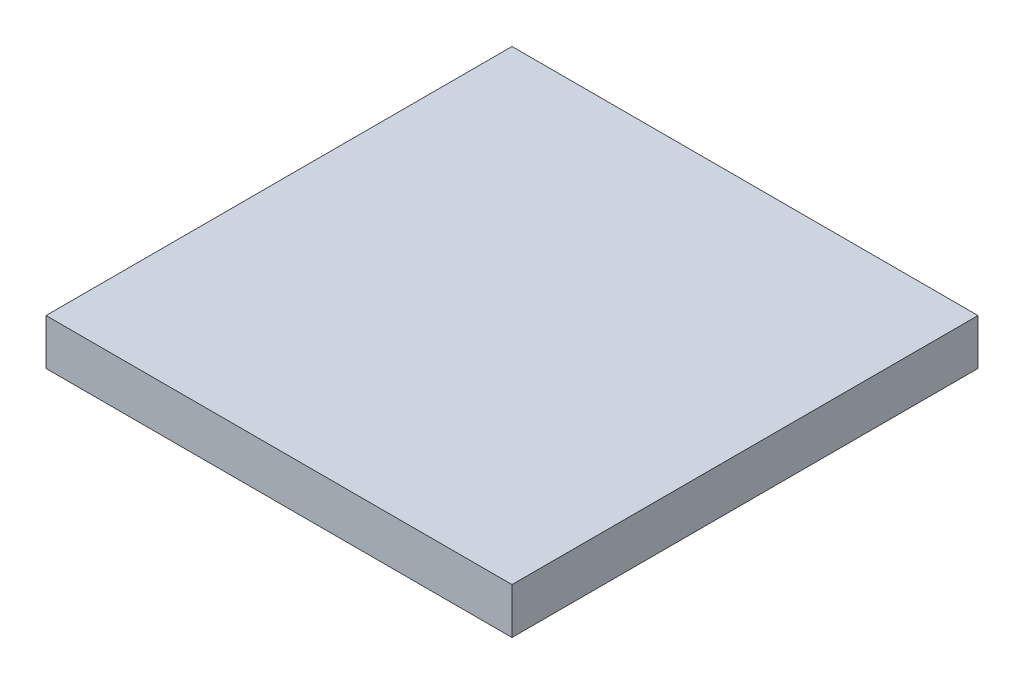
ISO-10303-21;
HEADER;
FILE_DESCRIPTION(('STEP AP214'),'2;1');
FILE_NAME('part.step','',(''),(''),'','','');
FILE_SCHEMA(('AUTOMOTIVE_DESIGN { 1 0 10303 214 1 1 1 1 }'));
ENDSEC;
DATA;
#1=APPLICATION_CONTEXT('core data for automotive mechanical design processes');
#2=APPLICATION_PROTOCOL_DEFINITION('international standard','automotive_design',2000,#1);
#3=PRODUCT_CONTEXT('',#1,'mechanical');
#4=PRODUCT('Part','Part','',(#3));
#5=PRODUCT_RELATED_PRODUCT_CATEGORY('part','',(#4));
#6=PRODUCT_DEFINITION_FORMATION('','',#4);
#7=PRODUCT_DEFINITION_CONTEXT('part definition',#1,'design');
#8=PRODUCT_DEFINITION('design','',#6,#7);
#9=PRODUCT_DEFINITION_SHAPE('','',#8);
#10=(LENGTH_UNIT() NAMED_UNIT(*) SI_UNIT(.MILLI.,.METRE.));
#11=(NAMED_UNIT(*) PLANE_ANGLE_UNIT() SI_UNIT($,.RADIAN.));
#12=(NAMED_UNIT(*) SI_UNIT($,.STERADIAN.) SOLID_ANGLE_UNIT());
#13=UNCERTAINTY_MEASURE_WITH_UNIT(LENGTH_MEASURE(1.E-05),#10,'distance_accuracy_value','');
#14=(GEOMETRIC_REPRESENTATION_CONTEXT(3) GLOBAL_UNCERTAINTY_ASSIGNED_CONTEXT((#13)) GLOBAL_UNIT_ASSIGNED_CONTEXT((#10,
#11,#12)) REPRESENTATION_CONTEXT('',''));
#15=CARTESIAN_POINT('',(0.,0.,0.));
#16=DIRECTION('',(0.,0.,1.));
#17=DIRECTION('',(1.,0.,0.));
#18=AXIS2_PLACEMENT_3D('',#15,#16,#17);
#19=CARTESIAN_POINT('',(50.8,10.,50.8));
#20=DIRECTION('',(-1.,0.,0.));
#21=DIRECTION('',(0.,0.,1.));
#22=AXIS2_PLACEMENT_3D('',#19,#20,#21);
#23=PLANE('',#22);
#24=DIRECTION('',(0.,0.,-1.));
#25=VECTOR('',#24,1.);
#26=CARTESIAN_POINT('',(50.8,0.,50.8));
#27=LINE('',#26,#25);
#28=CARTESIAN_POINT('',(50.8,0.,50.8));
#29=VERTEX_POINT('',#28);
#30=CARTESIAN_POINT('',(50.8,0.,-50.8));
#31=VERTEX_POINT('',#30);
#32=EDGE_CURVE('E98',#29,#31,#27,.T.);
#33=ORIENTED_EDGE('',*,*,#32,.T.);
#34=DIRECTION('',(0.,-1.,0.));
#35=VECTOR('',#34,1.);
#36=CARTESIAN_POINT('',(50.8,10.,-50.8));
#37=LINE('',#36,#35);
#38=CARTESIAN_POINT('',(50.8,10.,-50.8));
#39=VERTEX_POINT('',#38);
#40=EDGE_CURVE('E11',#39,#31,#37,.T.);
#41=ORIENTED_EDGE('',*,*,#40,.F.);
#42=DIRECTION('',(0.,0.,-1.));
#43=VECTOR('',#42,1.);
#44=CARTESIAN_POINT('',(50.8,10.,50.8));
#45=LINE('',#44,#43);
#46=CARTESIAN_POINT('',(50.8,10.,50.8));
#47=VERTEX_POINT('',#46);
#48=EDGE_CURVE('E86',#47,#39,#45,.T.);
#49=ORIENTED_EDGE('',*,*,#48,.F.);
#50=DIRECTION('',(0.,-1.,0.));
#51=VECTOR('',#50,1.);
#52=CARTESIAN_POINT('',(50.8,10.,50.8));
#53=LINE('',#52,#51);
#54=EDGE_CURVE('E94',#47,#29,#53,.T.);
#55=ORIENTED_EDGE('',*,*,#54,.T.);
#56=EDGE_LOOP('',(#33,#41,#49,#55));
#57=FACE_BOUND('',#56,.T.);
#58=ADVANCED_FACE('F35',(#57),#23,.F.);
#59=CARTESIAN_POINT('',(-50.8,10.,-50.8));
#60=DIRECTION('',(0.,0.,1.));
#61=DIRECTION('',(1.,0.,0.));
#62=AXIS2_PLACEMENT_3D('',#59,#60,#61);
#63=PLANE('',#62);
#64=DIRECTION('',(-1.,0.,0.));
#65=VECTOR('',#64,1.);
#66=CARTESIAN_POINT('',(-50.8,0.,-50.8));
#67=LINE('',#66,#65);
#68=CARTESIAN_POINT('',(-50.8,0.,-50.8));
#69=VERTEX_POINT('',#68);
#70=EDGE_CURVE('E90',#31,#69,#67,.T.);
#71=ORIENTED_EDGE('',*,*,#70,.T.);
#72=DIRECTION('',(0.,-1.,0.));
#73=VECTOR('',#72,1.);
#74=CARTESIAN_POINT('',(-50.8,10.,-50.8));
#75=LINE('',#74,#73);
#76=CARTESIAN_POINT('',(-50.8,10.,-50.8));
#77=VERTEX_POINT('',#76);
#78=EDGE_CURVE('E43',#77,#69,#75,.T.);
#79=ORIENTED_EDGE('',*,*,#78,.F.);
#80=DIRECTION('',(-1.,0.,0.));
#81=VECTOR('',#80,1.);
#82=CARTESIAN_POINT('',(-50.8,10.,-50.8));
#83=LINE('',#82,#81);
#84=EDGE_CURVE('E81',#39,#77,#83,.T.);
#85=ORIENTED_EDGE('',*,*,#84,.F.);
#86=ORIENTED_EDGE('',*,*,#40,.T.);
#87=EDGE_LOOP('',(#71,#79,#85,#86));
#88=FACE_BOUND('',#87,.T.);
#89=ADVANCED_FACE('F89',(#88),#63,.F.);
#90=CARTESIAN_POINT('',(-50.8,10.,50.8));
#91=DIRECTION('',(1.,0.,0.));
#92=DIRECTION('',(0.,0.,-1.));
#93=AXIS2_PLACEMENT_3D('',#90,#91,#92);
#94=PLANE('',#93);
#95=DIRECTION('',(0.,0.,1.));
#96=VECTOR('',#95,1.);
#97=CARTESIAN_POINT('',(-50.8,0.,50.8));
#98=LINE('',#97,#96);
#99=CARTESIAN_POINT('',(-50.8,0.,50.8));
#100=VERTEX_POINT('',#99);
#101=EDGE_CURVE('E68',#69,#100,#98,.T.);
#102=ORIENTED_EDGE('',*,*,#101,.T.);
#103=DIRECTION('',(0.,-1.,0.));
#104=VECTOR('',#103,1.);
#105=CARTESIAN_POINT('',(-50.8,10.,50.8));
#106=LINE('',#105,#104);
#107=CARTESIAN_POINT('',(-50.8,10.,50.8));
#108=VERTEX_POINT('',#107);
#109=EDGE_CURVE('E91',#108,#100,#106,.T.);
#110=ORIENTED_EDGE('',*,*,#109,.F.);
#111=DIRECTION('',(0.,0.,1.));
#112=VECTOR('',#111,1.);
#113=CARTESIAN_POINT('',(-50.8,10.,50.8));
#114=LINE('',#113,#112);
#115=EDGE_CURVE('E84',#77,#108,#114,.T.);
#116=ORIENTED_EDGE('',*,*,#115,.F.);
#117=ORIENTED_EDGE('',*,*,#78,.T.);
#118=EDGE_LOOP('',(#102,#110,#116,#117));
#119=FACE_BOUND('',#118,.T.);
#120=ADVANCED_FACE('F92',(#119),#94,.F.);
#121=CARTESIAN_POINT('',(-50.8,10.,50.8));
#122=DIRECTION('',(0.,0.,-1.));
#123=DIRECTION('',(-1.,0.,0.));
#124=AXIS2_PLACEMENT_3D('',#121,#122,#123);
#125=PLANE('',#124);
#126=DIRECTION('',(1.,0.,0.));
#127=VECTOR('',#126,1.);
#128=CARTESIAN_POINT('',(-50.8,0.,50.8));
#129=LINE('',#128,#127);
#130=EDGE_CURVE('E74',#100,#29,#129,.T.);
#131=ORIENTED_EDGE('',*,*,#130,.T.);
#132=ORIENTED_EDGE('',*,*,#54,.F.);
#133=DIRECTION('',(1.,0.,0.));
#134=VECTOR('',#133,1.);
#135=CARTESIAN_POINT('',(-50.8,10.,50.8));
#136=LINE('',#135,#134);
#137=EDGE_CURVE('E51',#108,#47,#136,.T.);
#138=ORIENTED_EDGE('',*,*,#137,.F.);
#139=ORIENTED_EDGE('',*,*,#109,.T.);
#140=EDGE_LOOP('',(#131,#132,#138,#139));
#141=FACE_BOUND('',#140,.T.);
#142=ADVANCED_FACE('F106',(#141),#125,.F.);
#143=CARTESIAN_POINT('',(0.,10.,0.));
#144=DIRECTION('',(0.,-1.,0.));
#145=DIRECTION('',(0.,0.,-1.));
#146=AXIS2_PLACEMENT_3D('',#143,#144,#145);
#147=PLANE('',#146);
#148=ORIENTED_EDGE('',*,*,#48,.T.);
#149=ORIENTED_EDGE('',*,*,#84,.T.);
#150=ORIENTED_EDGE('',*,*,#115,.T.);
#151=ORIENTED_EDGE('',*,*,#137,.T.);
#152=EDGE_LOOP('',(#148,#149,#150,#151));
#153=FACE_BOUND('',#152,.T.);
#154=ADVANCED_FACE('F82',(#153),#147,.F.);
#155=CARTESIAN_POINT('',(0.,0.,0.));
#156=DIRECTION('',(0.,-1.,0.));
#157=DIRECTION('',(0.,0.,-1.));
#158=AXIS2_PLACEMENT_3D('',#155,#156,#157);
#159=PLANE('',#158);
#160=CARTESIAN_POINT('',(0.,0.,0.));
#161=DIRECTION('',(0.,-1.,0.));
#162=DIRECTION('',(0.,0.,-1.));
#163=AXIS2_PLACEMENT_3D('',#160,#161,#162);
#164=CIRCLE('',#163,3.175);
#165=CARTESIAN_POINT('',(0.,0.,-3.175));
#166=VERTEX_POINT('',#165);
#167=EDGE_CURVE('E112',#166,#166,#164,.T.);
#168=ORIENTED_EDGE('',*,*,#167,.F.);
#169=EDGE_LOOP('',(#168));
#170=FACE_BOUND('',#169,.T.);
#171=ORIENTED_EDGE('',*,*,#32,.F.);
#172=ORIENTED_EDGE('',*,*,#130,.F.);
#173=ORIENTED_EDGE('',*,*,#101,.F.);
#174=ORIENTED_EDGE('',*,*,#70,.F.);
#175=EDGE_LOOP('',(#171,#172,#173,#174));
#176=FACE_BOUND('',#175,.T.);
#177=ADVANCED_FACE('F109',(#170,#176),#159,.T.);
#178=CARTESIAN_POINT('',(0.,5.,0.));
#179=DIRECTION('',(0.,-1.,0.));
#180=DIRECTION('',(0.,0.,-1.));
#181=AXIS2_PLACEMENT_3D('',#178,#179,#180);
#182=CYLINDRICAL_SURFACE('',#181,3.175);
#183=CARTESIAN_POINT('',(0.,5.,0.));
#184=DIRECTION('',(0.,-1.,0.));
#185=DIRECTION('',(0.,0.,-1.));
#186=AXIS2_PLACEMENT_3D('',#183,#184,#185);
#187=CIRCLE('',#186,3.175);
#188=CARTESIAN_POINT('',(0.,5.,-3.175));
#189=VERTEX_POINT('',#188);
#190=EDGE_CURVE('E101',#189,#189,#187,.T.);
#191=ORIENTED_EDGE('',*,*,#190,.F.);
#192=EDGE_LOOP('',(#191));
#193=FACE_BOUND('',#192,.T.);
#194=ORIENTED_EDGE('',*,*,#167,.T.);
#195=EDGE_LOOP('',(#194));
#196=FACE_BOUND('',#195,.T.);
#197=ADVANCED_FACE('F120',(#193,#196),#182,.F.);
#198=CARTESIAN_POINT('',(0.,5.,0.));
#199=DIRECTION('',(0.,-1.,0.));
#200=DIRECTION('',(0.,0.,-1.));
#201=AXIS2_PLACEMENT_3D('',#198,#199,#200);
#202=PLANE('',#201);
#203=ORIENTED_EDGE('',*,*,#190,.T.);
#204=EDGE_LOOP('',(#203));
#205=FACE_BOUND('',#204,.T.);
#206=ADVANCED_FACE('F118',(#205),#202,.T.);
#207=CLOSED_SHELL('',(#58,#89,#120,#142,#154,#177,#197,#206));
#208=MANIFOLD_SOLID_BREP('B2',#207);
#209=ADVANCED_BREP_SHAPE_REPRESENTATION('',(#18,#208),#14);
#210=SHAPE_DEFINITION_REPRESENTATION(#9,#209);
ENDSEC;
END-ISO-10303-21;
